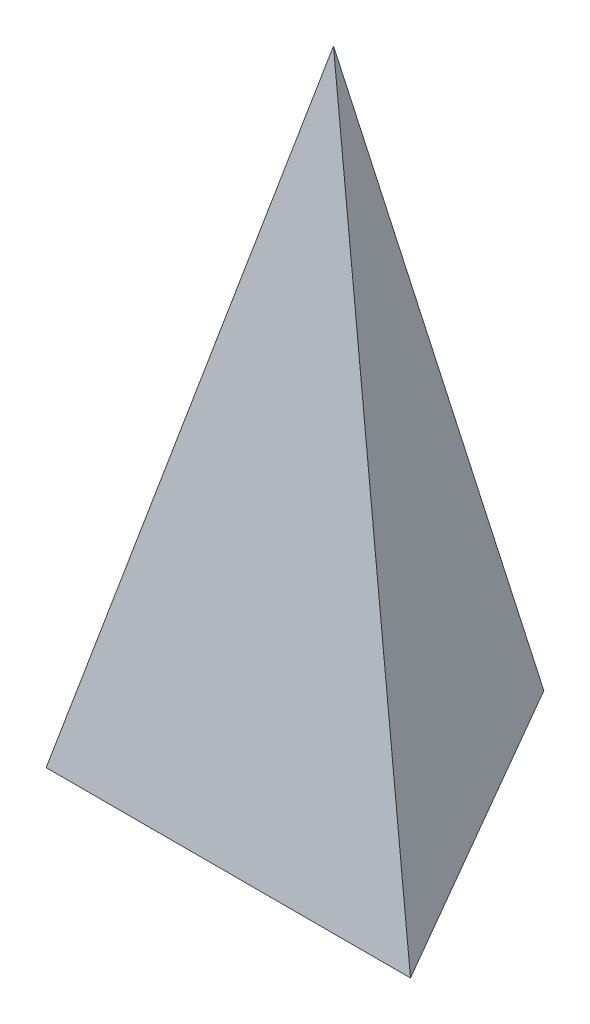
ISO-10303-21;
HEADER;
FILE_DESCRIPTION(('STEP AP214'),'2;1');
FILE_NAME('part.step','',(''),(''),'','','');
FILE_SCHEMA(('AUTOMOTIVE_DESIGN { 1 0 10303 214 1 1 1 1 }'));
ENDSEC;
DATA;
#1=APPLICATION_CONTEXT('core data for automotive mechanical design processes');
#2=APPLICATION_PROTOCOL_DEFINITION('international standard','automotive_design',2000,#1);
#3=PRODUCT_CONTEXT('',#1,'mechanical');
#4=PRODUCT('Part','Part','',(#3));
#5=PRODUCT_RELATED_PRODUCT_CATEGORY('part','',(#4));
#6=PRODUCT_DEFINITION_FORMATION('','',#4);
#7=PRODUCT_DEFINITION_CONTEXT('part definition',#1,'design');
#8=PRODUCT_DEFINITION('design','',#6,#7);
#9=PRODUCT_DEFINITION_SHAPE('','',#8);
#10=(LENGTH_UNIT() NAMED_UNIT(*) SI_UNIT(.MILLI.,.METRE.));
#11=(NAMED_UNIT(*) PLANE_ANGLE_UNIT() SI_UNIT($,.RADIAN.));
#12=(NAMED_UNIT(*) SI_UNIT($,.STERADIAN.) SOLID_ANGLE_UNIT());
#13=UNCERTAINTY_MEASURE_WITH_UNIT(LENGTH_MEASURE(1.E-05),#10,'distance_accuracy_value','');
#14=(GEOMETRIC_REPRESENTATION_CONTEXT(3) GLOBAL_UNCERTAINTY_ASSIGNED_CONTEXT((#13)) GLOBAL_UNIT_ASSIGNED_CONTEXT((#10,
#11,#12)) REPRESENTATION_CONTEXT('',''));
#15=CARTESIAN_POINT('',(0.,0.,0.));
#16=DIRECTION('',(0.,0.,1.));
#17=DIRECTION('',(1.,0.,0.));
#18=AXIS2_PLACEMENT_3D('',#15,#16,#17);
#19=CARTESIAN_POINT('',(0.,0.,0.));
#20=DIRECTION('',(0.,1.,0.));
#21=DIRECTION('',(0.,0.,1.));
#22=AXIS2_PLACEMENT_3D('',#19,#20,#21);
#23=PLANE('',#22);
#24=DIRECTION('',(-0.499999999999999,0.,-0.866025403784439));
#25=VECTOR('',#24,1.);
#26=CARTESIAN_POINT('',(24.0501028133628,0.,13.885333333333));
#27=LINE('',#26,#25);
#28=CARTESIAN_POINT('',(24.0501028133628,0.,13.885333333333));
#29=VERTEX_POINT('',#28);
#30=CARTESIAN_POINT('',(0.,0.,-27.7706666666667));
#31=VERTEX_POINT('',#30);
#32=EDGE_CURVE('E74',#29,#31,#27,.T.);
#33=ORIENTED_EDGE('',*,*,#32,.F.);
#34=DIRECTION('',(1.,0.,0.));
#35=VECTOR('',#34,1.);
#36=CARTESIAN_POINT('',(-24.050102813363,0.,13.8853333333335));
#37=LINE('',#36,#35);
#38=CARTESIAN_POINT('',(-24.050102813363,0.,13.8853333333335));
#39=VERTEX_POINT('',#38);
#40=EDGE_CURVE('E75',#39,#29,#37,.T.);
#41=ORIENTED_EDGE('',*,*,#40,.F.);
#42=DIRECTION('',(-0.499999999999998,0.,0.86602540378444));
#43=VECTOR('',#42,1.);
#44=CARTESIAN_POINT('',(0.,0.,-27.7706666666667));
#45=LINE('',#44,#43);
#46=EDGE_CURVE('E72',#31,#39,#45,.T.);
#47=ORIENTED_EDGE('',*,*,#46,.F.);
#48=EDGE_LOOP('',(#33,#41,#47));
#49=FACE_BOUND('',#48,.T.);
#50=ADVANCED_FACE('F40',(#49),#23,.F.);
#51=CARTESIAN_POINT('',(11.7303286450471,2.14699630589569,-6.77250840090072));
#52=DIRECTION('',(0.855346831149142,0.156553711520451,-0.49383472321445));
#53=DIRECTION('',(-0.499999999999999,0.,-0.866025403784439));
#54=AXIS2_PLACEMENT_3D('',#51,#52,#53);
#55=PLANE('',#54);
#56=DIRECTION('',(0.261708284389302,-0.953246224842255,0.151097348441316));
#57=VECTOR('',#56,1.);
#58=CARTESIAN_POINT('',(0.,87.6000917105217,0.));
#59=LINE('',#58,#57);
#60=CARTESIAN_POINT('',(0.,87.6000917105217,0.));
#61=VERTEX_POINT('',#60);
#62=EDGE_CURVE('E59',#61,#29,#59,.T.);
#63=ORIENTED_EDGE('',*,*,#62,.T.);
#64=ORIENTED_EDGE('',*,*,#32,.T.);
#65=DIRECTION('',(0.,-0.953246224842254,-0.30219469688264));
#66=VECTOR('',#65,1.);
#67=CARTESIAN_POINT('',(0.,87.6000917105217,0.));
#68=LINE('',#67,#66);
#69=EDGE_CURVE('E52',#61,#31,#68,.T.);
#70=ORIENTED_EDGE('',*,*,#69,.F.);
#71=EDGE_LOOP('',(#63,#64,#70));
#72=FACE_BOUND('',#71,.T.);
#73=ADVANCED_FACE('F85',(#72),#55,.T.);
#74=CARTESIAN_POINT('',(-11.7303286450471,2.14699630589568,-6.7725084009007));
#75=DIRECTION('',(-0.855346831149143,0.156553711520451,-0.493834723214449));
#76=DIRECTION('',(-0.499999999999998,0.,0.86602540378444));
#77=AXIS2_PLACEMENT_3D('',#74,#75,#76);
#78=PLANE('',#77);
#79=ORIENTED_EDGE('',*,*,#69,.T.);
#80=ORIENTED_EDGE('',*,*,#46,.T.);
#81=DIRECTION('',(-0.261708284389304,-0.953246224842254,0.151097348441322));
#82=VECTOR('',#81,1.);
#83=CARTESIAN_POINT('',(0.,87.6000917105217,0.));
#84=LINE('',#83,#82);
#85=EDGE_CURVE('E12',#61,#39,#84,.T.);
#86=ORIENTED_EDGE('',*,*,#85,.F.);
#87=EDGE_LOOP('',(#79,#80,#86));
#88=FACE_BOUND('',#87,.T.);
#89=ADVANCED_FACE('F89',(#88),#78,.T.);
#90=CARTESIAN_POINT('',(1.4264144259156E-13,2.14699630589566,13.5450168018014));
#91=DIRECTION('',(0.,0.15655371152045,0.987669446428901));
#92=DIRECTION('',(0.,-0.987669446428901,0.15655371152045));
#93=AXIS2_PLACEMENT_3D('',#90,#91,#92);
#94=PLANE('',#93);
#95=ORIENTED_EDGE('',*,*,#85,.T.);
#96=ORIENTED_EDGE('',*,*,#40,.T.);
#97=ORIENTED_EDGE('',*,*,#62,.F.);
#98=EDGE_LOOP('',(#95,#96,#97));
#99=FACE_BOUND('',#98,.T.);
#100=ADVANCED_FACE('F42',(#99),#94,.T.);
#101=CLOSED_SHELL('',(#50,#73,#89,#100));
#102=MANIFOLD_SOLID_BREP('B2',#101);
#103=ADVANCED_BREP_SHAPE_REPRESENTATION('',(#18,#102),#14);
#104=SHAPE_DEFINITION_REPRESENTATION(#9,#103);
ENDSEC;
END-ISO-10303-21;
